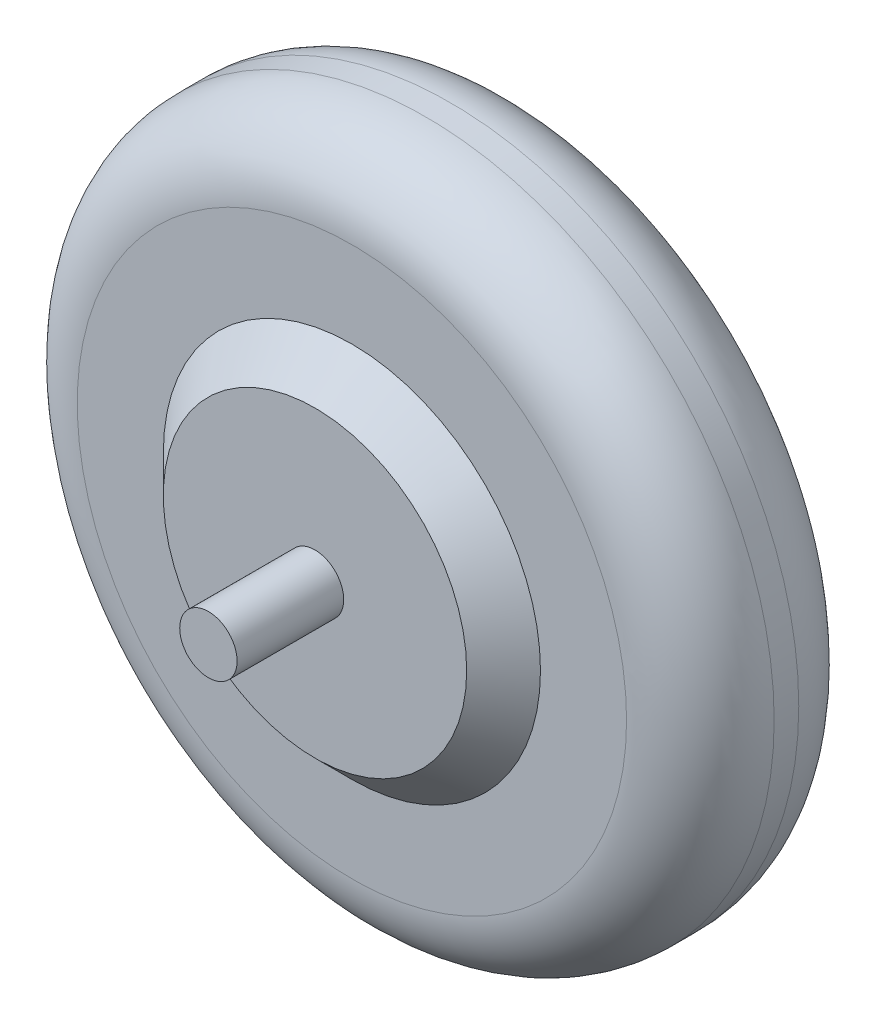
ISO-10303-21;
HEADER;
FILE_DESCRIPTION(('STEP AP214'),'2;1');
FILE_NAME('part.step','',(''),(''),'','','');
FILE_SCHEMA(('AUTOMOTIVE_DESIGN { 1 0 10303 214 1 1 1 1 }'));
ENDSEC;
DATA;
#1=APPLICATION_CONTEXT('core data for automotive mechanical design processes');
#2=APPLICATION_PROTOCOL_DEFINITION('international standard','automotive_design',2000,#1);
#3=PRODUCT_CONTEXT('',#1,'mechanical');
#4=PRODUCT('Part','Part','',(#3));
#5=PRODUCT_RELATED_PRODUCT_CATEGORY('part','',(#4));
#6=PRODUCT_DEFINITION_FORMATION('','',#4);
#7=PRODUCT_DEFINITION_CONTEXT('part definition',#1,'design');
#8=PRODUCT_DEFINITION('design','',#6,#7);
#9=PRODUCT_DEFINITION_SHAPE('','',#8);
#10=(LENGTH_UNIT() NAMED_UNIT(*) SI_UNIT(.MILLI.,.METRE.));
#11=(NAMED_UNIT(*) PLANE_ANGLE_UNIT() SI_UNIT($,.RADIAN.));
#12=(NAMED_UNIT(*) SI_UNIT($,.STERADIAN.) SOLID_ANGLE_UNIT());
#13=UNCERTAINTY_MEASURE_WITH_UNIT(LENGTH_MEASURE(1.E-05),#10,'distance_accuracy_value','');
#14=(GEOMETRIC_REPRESENTATION_CONTEXT(3) GLOBAL_UNCERTAINTY_ASSIGNED_CONTEXT((#13)) GLOBAL_UNIT_ASSIGNED_CONTEXT((#10,
#11,#12)) REPRESENTATION_CONTEXT('',''));
#15=CARTESIAN_POINT('',(0.,0.,0.));
#16=DIRECTION('',(0.,0.,1.));
#17=DIRECTION('',(1.,0.,0.));
#18=AXIS2_PLACEMENT_3D('',#15,#16,#17);
#19=CARTESIAN_POINT('',(0.,0.,-62.));
#20=DIRECTION('',(0.,0.,-1.));
#21=DIRECTION('',(-1.,0.,0.));
#22=AXIS2_PLACEMENT_3D('',#19,#20,#21);
#23=PLANE('',#22);
#24=CARTESIAN_POINT('',(0.,0.,-62.));
#25=DIRECTION('',(0.,0.,-1.));
#26=DIRECTION('',(-1.,0.,0.));
#27=AXIS2_PLACEMENT_3D('',#24,#25,#26);
#28=CIRCLE('',#27,6.00000000000001);
#29=CARTESIAN_POINT('',(-5.,3.31662479035541,-62.));
#30=VERTEX_POINT('',#29);
#31=CARTESIAN_POINT('',(0.,6.00000000000001,-62.));
#32=VERTEX_POINT('',#31);
#33=EDGE_CURVE('E273',#30,#32,#28,.T.);
#34=ORIENTED_EDGE('',*,*,#33,.T.);
#35=DIRECTION('',(0.,-1.,0.));
#36=VECTOR('',#35,1.);
#37=CARTESIAN_POINT('',(0.,0.,-62.));
#38=LINE('',#37,#36);
#39=CARTESIAN_POINT('',(0.,3.5,-62.));
#40=VERTEX_POINT('',#39);
#41=EDGE_CURVE('E119',#32,#40,#38,.T.);
#42=ORIENTED_EDGE('',*,*,#41,.T.);
#43=CARTESIAN_POINT('',(0.,0.,-62.));
#44=DIRECTION('',(0.,0.,-1.));
#45=DIRECTION('',(-1.,0.,0.));
#46=AXIS2_PLACEMENT_3D('',#43,#44,#45);
#47=CIRCLE('',#46,3.5);
#48=CARTESIAN_POINT('',(0.,-3.5,-62.));
#49=VERTEX_POINT('',#48);
#50=EDGE_CURVE('E283',#49,#40,#47,.T.);
#51=ORIENTED_EDGE('',*,*,#50,.F.);
#52=CARTESIAN_POINT('',(0.,-6.00000000000001,-62.));
#53=VERTEX_POINT('',#52);
#54=EDGE_CURVE('E124',#49,#53,#38,.T.);
#55=ORIENTED_EDGE('',*,*,#54,.T.);
#56=CARTESIAN_POINT('',(0.,0.,-62.));
#57=DIRECTION('',(0.,0.,-1.));
#58=DIRECTION('',(-1.,0.,0.));
#59=AXIS2_PLACEMENT_3D('',#56,#57,#58);
#60=CIRCLE('',#59,6.00000000000001);
#61=CARTESIAN_POINT('',(-5.,-3.31662479035541,-62.));
#62=VERTEX_POINT('',#61);
#63=EDGE_CURVE('E274',#53,#62,#60,.T.);
#64=ORIENTED_EDGE('',*,*,#63,.T.);
#65=DIRECTION('',(0.,1.,0.));
#66=VECTOR('',#65,1.);
#67=CARTESIAN_POINT('',(-5.,0.,-62.));
#68=LINE('',#67,#66);
#69=EDGE_CURVE('E267',#62,#30,#68,.T.);
#70=ORIENTED_EDGE('',*,*,#69,.T.);
#71=EDGE_LOOP('',(#34,#42,#51,#55,#64,#70));
#72=FACE_BOUND('',#71,.T.);
#73=ADVANCED_FACE('F39',(#72),#23,.T.);
#74=CARTESIAN_POINT('',(0.,0.,-17.));
#75=DIRECTION('',(0.,0.,-1.));
#76=DIRECTION('',(-1.,0.,0.));
#77=AXIS2_PLACEMENT_3D('',#74,#75,#76);
#78=CYLINDRICAL_SURFACE('',#77,3.5);
#79=CARTESIAN_POINT('',(0.,0.,-17.));
#80=DIRECTION('',(0.,0.,-1.));
#81=DIRECTION('',(-1.,0.,0.));
#82=AXIS2_PLACEMENT_3D('',#79,#80,#81);
#83=CIRCLE('',#82,3.5);
#84=CARTESIAN_POINT('',(-3.5,0.,-17.));
#85=VERTEX_POINT('',#84);
#86=EDGE_CURVE('E173',#85,#85,#83,.T.);
#87=ORIENTED_EDGE('',*,*,#86,.F.);
#88=EDGE_LOOP('',(#87));
#89=FACE_BOUND('',#88,.T.);
#90=DIRECTION('',(0.,0.,-1.));
#91=VECTOR('',#90,1.);
#92=CARTESIAN_POINT('',(0.,-3.5,-17.));
#93=LINE('',#92,#91);
#94=CARTESIAN_POINT('',(0.,-3.5,-55.9378221735089));
#95=VERTEX_POINT('',#94);
#96=EDGE_CURVE('E288',#49,#95,#93,.F.);
#97=ORIENTED_EDGE('',*,*,#96,.F.);
#98=ORIENTED_EDGE('',*,*,#50,.T.);
#99=DIRECTION('',(0.,0.,-1.));
#100=VECTOR('',#99,1.);
#101=CARTESIAN_POINT('',(0.,3.5,-17.));
#102=LINE('',#101,#100);
#103=CARTESIAN_POINT('',(0.,3.5,-55.9378221735089));
#104=VERTEX_POINT('',#103);
#105=EDGE_CURVE('E287',#104,#40,#102,.T.);
#106=ORIENTED_EDGE('',*,*,#105,.F.);
#107=CARTESIAN_POINT('',(0.,3.5,-55.9378221735089));
#108=CARTESIAN_POINT('',(0.0916614106132162,3.50001651318873,-55.9378491324622));
#109=CARTESIAN_POINT('',(0.18330783847139,3.49639979045156,-55.9357439525906));
#110=CARTESIAN_POINT('',(0.36580025899866,3.48202985654384,-55.9274723056872));
#111=CARTESIAN_POINT('',(0.456646708730063,3.4712810300505,-55.9213083339386));
#112=CARTESIAN_POINT('',(0.636366547399989,3.44285826737843,-55.9051680198482));
#113=CARTESIAN_POINT('',(0.725248260587919,3.42522437530652,-55.8952137304526));
#114=CARTESIAN_POINT('',(0.900938654282858,3.38326415889156,-55.8718600499086));
#115=CARTESIAN_POINT('',(0.987747095428591,3.35893706583233,-55.8584602630553));
#116=CARTESIAN_POINT('',(1.24384968450897,3.27641552648077,-55.8138029850928));
#117=CARTESIAN_POINT('',(1.40936471778677,3.20859298159029,-55.7780344118746));
#118=CARTESIAN_POINT('',(1.72678349029069,3.04956767111259,-55.698570475309));
#119=CARTESIAN_POINT('',(1.87866564252661,2.95832867849381,-55.6548628605585));
#120=CARTESIAN_POINT('',(2.17808050806032,2.74631964906835,-55.5601042618337));
#121=CARTESIAN_POINT('',(2.32424149658465,2.62374464456448,-55.5087450506434));
#122=CARTESIAN_POINT('',(2.59495627349913,2.35636512618243,-55.4069702272501));
#123=CARTESIAN_POINT('',(2.71950419979423,2.21155460139175,-55.3565548743466));
#124=CARTESIAN_POINT('',(2.95179799377422,1.89167369295779,-55.2582436589313));
#125=CARTESIAN_POINT('',(3.05784144738486,1.71522030585591,-55.2107477899197));
#126=CARTESIAN_POINT('',(3.19299061321122,1.43717815530636,-55.1484586891389));
#127=CARTESIAN_POINT('',(3.23406538888504,1.34223180904005,-55.1291824856837));
#128=CARTESIAN_POINT('',(3.30781168974839,1.14851994741149,-55.0941649556951));
#129=CARTESIAN_POINT('',(3.34048793504924,1.04975661332343,-55.0784216442527));
#130=CARTESIAN_POINT('',(3.39501688969959,0.856293812361105,-55.051934457675));
#131=CARTESIAN_POINT('',(3.41747166572956,0.761800976383333,-55.0409157371288));
#132=CARTESIAN_POINT('',(3.45448155122859,0.570962688949776,-55.0226664657273));
#133=CARTESIAN_POINT('',(3.46904052545878,0.474618167794387,-55.0154340616425));
#134=CARTESIAN_POINT('',(3.49007309097626,0.280853657180163,-55.0049642869495));
#135=CARTESIAN_POINT('',(3.49654886840493,0.183433965700494,-55.0017258361593));
#136=CARTESIAN_POINT('',(3.50134238028244,-0.0116257308125945,-54.9993284204132));
#137=CARTESIAN_POINT('',(3.49966061376685,-0.109265722003992,-55.0001692059111));
#138=CARTESIAN_POINT('',(3.48337483784478,-0.384296801255904,-55.0083078266267));
#139=CARTESIAN_POINT('',(3.45926330114768,-0.56109576080786,-55.0203561361947));
#140=CARTESIAN_POINT('',(3.38491926786074,-0.907633271701649,-55.056898622937));
#141=CARTESIAN_POINT('',(3.33468531485208,-1.07737142880839,-55.0813934940502));
#142=CARTESIAN_POINT('',(3.20921045116487,-1.40807298244682,-55.1409952713425));
#143=CARTESIAN_POINT('',(3.13363312281082,-1.56888245594173,-55.1762443324252));
#144=CARTESIAN_POINT('',(2.96008039903263,-1.8759187786992,-55.2541814480871));
#145=CARTESIAN_POINT('',(2.86209665424759,-2.02214016271809,-55.2968722742974));
#146=CARTESIAN_POINT('',(2.63587110135662,-2.31059815388992,-55.3904433918485));
#147=CARTESIAN_POINT('',(2.50564553098241,-2.45115403567686,-55.441716341548));
#148=CARTESIAN_POINT('',(2.22396641369221,-2.7093470037211,-55.5440902878225));
#149=CARTESIAN_POINT('',(2.07249396563669,-2.82696345798846,-55.5951910893479));
#150=CARTESIAN_POINT('',(1.74057142656073,-3.0433576919829,-55.6949942738554));
#151=CARTESIAN_POINT('',(1.55888564357469,-3.14044252971586,-55.7433323954387));
#152=CARTESIAN_POINT('',(1.27418493247696,-3.26145680927839,-55.80605473572));
#153=CARTESIAN_POINT('',(1.17731033622517,-3.29768010784926,-55.8253237851619));
#154=CARTESIAN_POINT('',(0.980110609154598,-3.3615642090718,-55.8598694712466));
#155=CARTESIAN_POINT('',(0.879786994444197,-3.389228721819,-55.8751478373378));
#156=CARTESIAN_POINT('',(0.651355096066804,-3.44130970453806,-55.904222174323));
#157=CARTESIAN_POINT('',(0.522494881956278,-3.46324371558164,-55.9167239286881));
#158=CARTESIAN_POINT('',(0.327551673421803,-3.48525610307998,-55.9293285418068));
#159=CARTESIAN_POINT('',(0.262226521326312,-3.49077885186311,-55.9325055032429));
#160=CARTESIAN_POINT('',(0.131274595581618,-3.4981521730547,-55.9367549015169));
#161=CARTESIAN_POINT('',(0.0656477095949152,-3.50000124407169,-55.9378264779052));
#162=CARTESIAN_POINT('',(0.,-3.5,-55.9378221735089));
#163=B_SPLINE_CURVE_WITH_KNOTS('',3,(#107,#108,#109,#110,#111,#112,#113,#114,#115,#116,#117,
#118,#119,#120,#121,#122,#123,#124,#125,#126,#127,#128,#129,#130,#131,#132,#133,#134,#135,#136,
#137,#138,#139,#140,#141,#142,#143,#144,#145,#146,#147,#148,#149,#150,#151,#152,#153,#154,#155,
#156,#157,#158,#159,#160,#161,#162),.UNSPECIFIED.,.F.,.F.,(4,2,2,2,2,2,2,2,2,2,2,2,2,2,2,2,2,2,
2,2,2,2,2,2,2,2,2,4),(0.,0.274864177751955,0.54955953078364,0.822680477503826,1.09583280535154,
1.64049867517977,2.18601231816781,2.7761426380743,3.36643276926798,3.99658159461522,
4.31189570928676,4.62703222285006,4.91987971471091,5.21258373673095,5.50520857830588,
5.79781551885987,6.33157319195034,6.86536062714517,7.40653440283131,7.94791016706229,
8.54041803466568,9.13345637783704,9.76454552647258,10.0797576744246,10.3948329909235,
10.787590386813,10.9843776384837,11.1812452983972),.UNSPECIFIED.);
#164=EDGE_CURVE('E131',#104,#95,#163,.T.);
#165=ORIENTED_EDGE('',*,*,#164,.T.);
#166=EDGE_LOOP('',(#97,#98,#106,#165));
#167=FACE_BOUND('',#166,.T.);
#168=ADVANCED_FACE('F204',(#89,#167),#78,.F.);
#169=CARTESIAN_POINT('',(0.,0.,-62.));
#170=DIRECTION('',(0.,0.,1.));
#171=DIRECTION('',(1.,0.,0.));
#172=AXIS2_PLACEMENT_3D('',#169,#170,#171);
#173=CYLINDRICAL_SURFACE('',#172,7.);
#174=CARTESIAN_POINT('',(0.,0.,-30.));
#175=DIRECTION('',(0.,0.,1.));
#176=DIRECTION('',(1.,0.,0.));
#177=AXIS2_PLACEMENT_3D('',#174,#175,#176);
#178=CIRCLE('',#177,7.);
#179=CARTESIAN_POINT('',(7.,0.,-30.));
#180=VERTEX_POINT('',#179);
#181=EDGE_CURVE('E259',#180,#180,#178,.F.);
#182=ORIENTED_EDGE('',*,*,#181,.T.);
#183=EDGE_LOOP('',(#182));
#184=FACE_BOUND('',#183,.T.);
#185=CARTESIAN_POINT('',(0.,0.,-61.));
#186=DIRECTION('',(0.,0.,-1.));
#187=DIRECTION('',(-1.,0.,0.));
#188=AXIS2_PLACEMENT_3D('',#185,#186,#187);
#189=CIRCLE('',#188,7.);
#190=CARTESIAN_POINT('',(-5.,-4.89897948556636,-61.));
#191=VERTEX_POINT('',#190);
#192=CARTESIAN_POINT('',(0.999999999999995,-6.92820323027551,-61.));
#193=VERTEX_POINT('',#192);
#194=EDGE_CURVE('E314',#191,#193,#189,.F.);
#195=ORIENTED_EDGE('',*,*,#194,.T.);
#196=CARTESIAN_POINT('',(0.,0.,-62.));
#197=DIRECTION('',(-0.707106781186547,0.,0.707106781186547));
#198=DIRECTION('',(0.707106781186547,0.,0.707106781186547));
#199=AXIS2_PLACEMENT_3D('',#196,#197,#198);
#200=ELLIPSE('',#199,9.89949493661167,7.);
#201=CARTESIAN_POINT('',(5.,-4.89897948556635,-57.));
#202=VERTEX_POINT('',#201);
#203=EDGE_CURVE('E142',#193,#202,#200,.T.);
#204=ORIENTED_EDGE('',*,*,#203,.T.);
#205=DIRECTION('',(0.,0.,1.));
#206=VECTOR('',#205,1.);
#207=CARTESIAN_POINT('',(5.,-4.89897948556636,-62.));
#208=LINE('',#207,#206);
#209=CARTESIAN_POINT('',(5.,-4.89897948556636,-34.));
#210=VERTEX_POINT('',#209);
#211=EDGE_CURVE('E300',#210,#202,#208,.F.);
#212=ORIENTED_EDGE('',*,*,#211,.F.);
#213=CARTESIAN_POINT('',(0.,0.,-34.));
#214=DIRECTION('',(0.,0.,-1.));
#215=DIRECTION('',(-1.,0.,0.));
#216=AXIS2_PLACEMENT_3D('',#213,#214,#215);
#217=CIRCLE('',#216,7.);
#218=CARTESIAN_POINT('',(5.,4.89897948556636,-34.));
#219=VERTEX_POINT('',#218);
#220=EDGE_CURVE('E272',#219,#210,#217,.T.);
#221=ORIENTED_EDGE('',*,*,#220,.F.);
#222=DIRECTION('',(0.,0.,1.));
#223=VECTOR('',#222,1.);
#224=CARTESIAN_POINT('',(5.,4.89897948556636,-62.));
#225=LINE('',#224,#223);
#226=CARTESIAN_POINT('',(5.,4.89897948556635,-57.));
#227=VERTEX_POINT('',#226);
#228=EDGE_CURVE('E303',#227,#219,#225,.T.);
#229=ORIENTED_EDGE('',*,*,#228,.F.);
#230=CARTESIAN_POINT('',(0.999999999999995,6.92820323027551,-61.));
#231=VERTEX_POINT('',#230);
#232=EDGE_CURVE('E137',#227,#231,#200,.T.);
#233=ORIENTED_EDGE('',*,*,#232,.T.);
#234=CARTESIAN_POINT('',(0.,0.,-61.));
#235=DIRECTION('',(0.,0.,-1.));
#236=DIRECTION('',(-1.,0.,0.));
#237=AXIS2_PLACEMENT_3D('',#234,#235,#236);
#238=CIRCLE('',#237,7.);
#239=CARTESIAN_POINT('',(-5.,4.89897948556636,-61.));
#240=VERTEX_POINT('',#239);
#241=EDGE_CURVE('E62',#231,#240,#238,.F.);
#242=ORIENTED_EDGE('',*,*,#241,.T.);
#243=DIRECTION('',(0.,0.,1.));
#244=VECTOR('',#243,1.);
#245=CARTESIAN_POINT('',(-5.,4.89897948556636,-62.));
#246=LINE('',#245,#244);
#247=CARTESIAN_POINT('',(-5.,4.89897948556636,-34.));
#248=VERTEX_POINT('',#247);
#249=EDGE_CURVE('E280',#248,#240,#246,.F.);
#250=ORIENTED_EDGE('',*,*,#249,.F.);
#251=CARTESIAN_POINT('',(-5.,-4.89897948556636,-34.));
#252=VERTEX_POINT('',#251);
#253=EDGE_CURVE('E270',#252,#248,#217,.T.);
#254=ORIENTED_EDGE('',*,*,#253,.F.);
#255=DIRECTION('',(0.,0.,1.));
#256=VECTOR('',#255,1.);
#257=CARTESIAN_POINT('',(-5.,-4.89897948556636,-62.));
#258=LINE('',#257,#256);
#259=EDGE_CURVE('E298',#191,#252,#258,.T.);
#260=ORIENTED_EDGE('',*,*,#259,.F.);
#261=EDGE_LOOP('',(#195,#204,#212,#221,#229,#233,#242,#250,#254,#260));
#262=FACE_BOUND('',#261,.T.);
#263=ADVANCED_FACE('F217',(#184,#262),#173,.T.);
#264=CARTESIAN_POINT('',(0.,0.,21.));
#265=DIRECTION('',(0.,0.,-1.));
#266=DIRECTION('',(-1.,0.,0.));
#267=AXIS2_PLACEMENT_3D('',#264,#265,#266);
#268=CYLINDRICAL_SURFACE('',#267,85.);
#269=CARTESIAN_POINT('',(0.,0.,-3.00000000000001));
#270=DIRECTION('',(0.,0.,1.));
#271=DIRECTION('',(1.,0.,0.));
#272=AXIS2_PLACEMENT_3D('',#269,#270,#271);
#273=CIRCLE('',#272,85.);
#274=CARTESIAN_POINT('',(-85.,0.,-3.00000000000001));
#275=VERTEX_POINT('',#274);
#276=EDGE_CURVE('E355',#275,#275,#273,.T.);
#277=CARTESIAN_POINT('',(0.,0.,3.));
#278=DIRECTION('',(0.,0.,1.));
#279=DIRECTION('',(1.,0.,0.));
#280=AXIS2_PLACEMENT_3D('',#277,#278,#279);
#281=CIRCLE('',#280,85.);
#282=CARTESIAN_POINT('',(-85.,0.,3.));
#283=VERTEX_POINT('',#282);
#284=EDGE_CURVE('E350',#283,#283,#281,.F.);
#285=CARTESIAN_POINT('',(-85.,0.,-3.00000000000001));
#286=CARTESIAN_POINT('',(-85.,0.,-2.93750000000001));
#287=CARTESIAN_POINT('',(-85.,0.,-2.87500000000001));
#288=CARTESIAN_POINT('',(-85.,0.,-2.75000000000001));
#289=CARTESIAN_POINT('',(-85.,0.,-2.68750000000001));
#290=CARTESIAN_POINT('',(-85.,0.,-2.56250000000001));
#291=CARTESIAN_POINT('',(-85.,0.,-2.50000000000001));
#292=CARTESIAN_POINT('',(-85.,0.,-2.37500000000001));
#293=CARTESIAN_POINT('',(-85.,0.,-2.31250000000001));
#294=CARTESIAN_POINT('',(-85.,0.,-2.18750000000001));
#295=CARTESIAN_POINT('',(-85.,0.,-2.12500000000001));
#296=CARTESIAN_POINT('',(-85.,0.,-2.00000000000001));
#297=CARTESIAN_POINT('',(-85.,0.,-1.93750000000001));
#298=CARTESIAN_POINT('',(-85.,0.,-1.81250000000001));
#299=CARTESIAN_POINT('',(-85.,0.,-1.75000000000001));
#300=CARTESIAN_POINT('',(-85.,0.,-1.62500000000001));
#301=CARTESIAN_POINT('',(-85.,0.,-1.56250000000001));
#302=CARTESIAN_POINT('',(-85.,0.,-1.43750000000001));
#303=CARTESIAN_POINT('',(-85.,0.,-1.37500000000001));
#304=CARTESIAN_POINT('',(-85.,0.,-1.25000000000001));
#305=CARTESIAN_POINT('',(-85.,0.,-1.18750000000001));
#306=CARTESIAN_POINT('',(-85.,0.,-1.06250000000001));
#307=CARTESIAN_POINT('',(-85.,0.,-1.00000000000001));
#308=CARTESIAN_POINT('',(-85.,0.,-0.875000000000008));
#309=CARTESIAN_POINT('',(-85.,0.,-0.812500000000008));
#310=CARTESIAN_POINT('',(-85.,0.,-0.687500000000008));
#311=CARTESIAN_POINT('',(-85.,0.,-0.625000000000008));
#312=CARTESIAN_POINT('',(-85.,0.,-0.500000000000007));
#313=CARTESIAN_POINT('',(-85.,0.,-0.437500000000007));
#314=CARTESIAN_POINT('',(-85.,0.,-0.312500000000007));
#315=CARTESIAN_POINT('',(-85.,0.,-0.250000000000007));
#316=CARTESIAN_POINT('',(-85.,0.,-0.125000000000007));
#317=CARTESIAN_POINT('',(-85.,0.,-0.062500000000007));
#318=CARTESIAN_POINT('',(-85.,0.,0.0624999999999931));
#319=CARTESIAN_POINT('',(-85.,0.,0.124999999999993));
#320=CARTESIAN_POINT('',(-85.,0.,0.249999999999993));
#321=CARTESIAN_POINT('',(-85.,0.,0.312499999999993));
#322=CARTESIAN_POINT('',(-85.,0.,0.437499999999993));
#323=CARTESIAN_POINT('',(-85.,0.,0.499999999999994));
#324=CARTESIAN_POINT('',(-85.,0.,0.624999999999994));
#325=CARTESIAN_POINT('',(-85.,0.,0.687499999999994));
#326=CARTESIAN_POINT('',(-85.,0.,0.812499999999994));
#327=CARTESIAN_POINT('',(-85.,0.,0.874999999999994));
#328=CARTESIAN_POINT('',(-85.,0.,0.999999999999994));
#329=CARTESIAN_POINT('',(-85.,0.,1.06249999999999));
#330=CARTESIAN_POINT('',(-85.,0.,1.18749999999999));
#331=CARTESIAN_POINT('',(-85.,0.,1.24999999999999));
#332=CARTESIAN_POINT('',(-85.,0.,1.37499999999999));
#333=CARTESIAN_POINT('',(-85.,0.,1.43749999999999));
#334=CARTESIAN_POINT('',(-85.,0.,1.56249999999999));
#335=CARTESIAN_POINT('',(-85.,0.,1.62499999999999));
#336=CARTESIAN_POINT('',(-85.,0.,1.74999999999999));
#337=CARTESIAN_POINT('',(-85.,0.,1.81249999999999));
#338=CARTESIAN_POINT('',(-85.,0.,1.93749999999999));
#339=CARTESIAN_POINT('',(-85.,0.,1.99999999999999));
#340=CARTESIAN_POINT('',(-85.,0.,2.125));
#341=CARTESIAN_POINT('',(-85.,0.,2.1875));
#342=CARTESIAN_POINT('',(-85.,0.,2.3125));
#343=CARTESIAN_POINT('',(-85.,0.,2.375));
#344=CARTESIAN_POINT('',(-85.,0.,2.5));
#345=CARTESIAN_POINT('',(-85.,0.,2.5625));
#346=CARTESIAN_POINT('',(-85.,0.,2.6875));
#347=CARTESIAN_POINT('',(-85.,0.,2.75));
#348=CARTESIAN_POINT('',(-85.,0.,2.875));
#349=CARTESIAN_POINT('',(-85.,0.,2.9375));
#350=CARTESIAN_POINT('',(-85.,0.,3.));
#351=B_SPLINE_CURVE_WITH_KNOTS('',3,(#285,#286,#287,#288,#289,#290,#291,#292,#293,#294,#295,
#296,#297,#298,#299,#300,#301,#302,#303,#304,#305,#306,#307,#308,#309,#310,#311,#312,#313,#314,
#315,#316,#317,#318,#319,#320,#321,#322,#323,#324,#325,#326,#327,#328,#329,#330,#331,#332,#333,
#334,#335,#336,#337,#338,#339,#340,#341,#342,#343,#344,#345,#346,#347,#348,#349,#350),
.UNSPECIFIED.,.F.,.F.,(4,2,2,2,2,2,2,2,2,2,2,2,2,2,2,2,2,2,2,2,2,2,2,2,2,2,2,2,2,2,2,2,4),(0.,
0.1875,0.375,0.5625,0.750000000000001,0.937500000000001,1.125,1.3125,1.5,1.6875,1.875,2.0625,
2.25,2.4375,2.625,2.8125,3.,3.1875,3.375,3.5625,3.75,3.9375,4.125,4.3125,4.5,4.6875,4.875,
5.0625,5.25,5.4375,5.62500000000001,5.81250000000001,6.00000000000001),.UNSPECIFIED.);
#352=EDGE_CURVE('BSEAM220',#275,#283,#351,.T.);
#353=ORIENTED_EDGE('',*,*,#276,.T.);
#354=ORIENTED_EDGE('',*,*,#284,.T.);
#355=ORIENTED_EDGE('',*,*,#352,.T.);
#356=ORIENTED_EDGE('',*,*,#352,.F.);
#357=EDGE_LOOP('',(#353,#355,#354,#356));
#358=FACE_BOUND('',#357,.T.);
#359=ADVANCED_FACE('F220',(#358),#268,.T.);
#360=CARTESIAN_POINT('',(0.,0.,21.));
#361=DIRECTION('',(0.,0.,1.));
#362=DIRECTION('',(1.,0.,0.));
#363=AXIS2_PLACEMENT_3D('',#360,#361,#362);
#364=PLANE('',#363);
#365=CARTESIAN_POINT('',(0.,0.,21.));
#366=DIRECTION('',(0.,0.,1.));
#367=DIRECTION('',(1.,0.,0.));
#368=AXIS2_PLACEMENT_3D('',#365,#366,#367);
#369=CIRCLE('',#368,67.);
#370=CARTESIAN_POINT('',(67.,0.,21.));
#371=VERTEX_POINT('',#370);
#372=EDGE_CURVE('E12',#371,#371,#369,.T.);
#373=ORIENTED_EDGE('',*,*,#372,.T.);
#374=EDGE_LOOP('',(#373));
#375=FACE_BOUND('',#374,.T.);
#376=CARTESIAN_POINT('',(0.,0.,21.));
#377=DIRECTION('',(0.,0.,1.));
#378=DIRECTION('',(1.,0.,0.));
#379=AXIS2_PLACEMENT_3D('',#376,#377,#378);
#380=CIRCLE('',#379,45.9999999999999);
#381=CARTESIAN_POINT('',(45.9999999999999,0.,21.));
#382=VERTEX_POINT('',#381);
#383=EDGE_CURVE('E255',#382,#382,#380,.F.);
#384=ORIENTED_EDGE('',*,*,#383,.T.);
#385=EDGE_LOOP('',(#384));
#386=FACE_BOUND('',#385,.T.);
#387=ADVANCED_FACE('F232',(#375,#386),#364,.T.);
#388=CARTESIAN_POINT('',(0.,0.,-21.));
#389=DIRECTION('',(0.,0.,1.));
#390=DIRECTION('',(1.,0.,0.));
#391=AXIS2_PLACEMENT_3D('',#388,#389,#390);
#392=PLANE('',#391);
#393=CARTESIAN_POINT('',(0.,0.,-21.));
#394=DIRECTION('',(0.,0.,1.));
#395=DIRECTION('',(1.,0.,0.));
#396=AXIS2_PLACEMENT_3D('',#393,#394,#395);
#397=CIRCLE('',#396,67.);
#398=CARTESIAN_POINT('',(67.,0.,-21.));
#399=VERTEX_POINT('',#398);
#400=EDGE_CURVE('E47',#399,#399,#397,.F.);
#401=ORIENTED_EDGE('',*,*,#400,.T.);
#402=EDGE_LOOP('',(#401));
#403=FACE_BOUND('',#402,.T.);
#404=CARTESIAN_POINT('',(0.,0.,-21.));
#405=DIRECTION('',(0.,0.,1.));
#406=DIRECTION('',(1.,0.,0.));
#407=AXIS2_PLACEMENT_3D('',#404,#405,#406);
#408=CIRCLE('',#407,45.9999999999998);
#409=CARTESIAN_POINT('',(45.9999999999998,0.,-21.));
#410=VERTEX_POINT('',#409);
#411=EDGE_CURVE('E253',#410,#410,#408,.T.);
#412=ORIENTED_EDGE('',*,*,#411,.T.);
#413=EDGE_LOOP('',(#412));
#414=FACE_BOUND('',#413,.T.);
#415=ADVANCED_FACE('F230',(#403,#414),#392,.F.);
#416=CARTESIAN_POINT('',(0.,0.,-30.));
#417=DIRECTION('',(0.,0.,1.));
#418=DIRECTION('',(1.,0.,0.));
#419=AXIS2_PLACEMENT_3D('',#416,#417,#418);
#420=PLANE('',#419);
#421=ORIENTED_EDGE('',*,*,#181,.F.);
#422=EDGE_LOOP('',(#421));
#423=FACE_BOUND('',#422,.T.);
#424=CARTESIAN_POINT('',(0.,0.,-30.));
#425=DIRECTION('',(0.,0.,1.));
#426=DIRECTION('',(1.,0.,0.));
#427=AXIS2_PLACEMENT_3D('',#424,#425,#426);
#428=CIRCLE('',#427,36.9999999999999);
#429=CARTESIAN_POINT('',(36.9999999999999,0.,-30.));
#430=VERTEX_POINT('',#429);
#431=EDGE_CURVE('E250',#430,#430,#428,.F.);
#432=ORIENTED_EDGE('',*,*,#431,.T.);
#433=EDGE_LOOP('',(#432));
#434=FACE_BOUND('',#433,.T.);
#435=ADVANCED_FACE('F226',(#423,#434),#420,.F.);
#436=CARTESIAN_POINT('',(0.,0.,30.));
#437=DIRECTION('',(0.,0.,1.));
#438=DIRECTION('',(1.,0.,0.));
#439=AXIS2_PLACEMENT_3D('',#436,#437,#438);
#440=PLANE('',#439);
#441=CARTESIAN_POINT('',(0.,0.,30.));
#442=DIRECTION('',(0.,0.,1.));
#443=DIRECTION('',(1.,0.,0.));
#444=AXIS2_PLACEMENT_3D('',#441,#442,#443);
#445=CIRCLE('',#444,7.);
#446=CARTESIAN_POINT('',(-7.,0.,30.));
#447=VERTEX_POINT('',#446);
#448=EDGE_CURVE('E321',#447,#447,#445,.T.);
#449=ORIENTED_EDGE('',*,*,#448,.F.);
#450=EDGE_LOOP('',(#449));
#451=FACE_BOUND('',#450,.T.);
#452=CARTESIAN_POINT('',(0.,0.,30.));
#453=DIRECTION('',(0.,0.,1.));
#454=DIRECTION('',(1.,0.,0.));
#455=AXIS2_PLACEMENT_3D('',#452,#453,#454);
#456=CIRCLE('',#455,36.9999999999998);
#457=CARTESIAN_POINT('',(36.9999999999998,0.,30.));
#458=VERTEX_POINT('',#457);
#459=EDGE_CURVE('E256',#458,#458,#456,.T.);
#460=ORIENTED_EDGE('',*,*,#459,.T.);
#461=EDGE_LOOP('',(#460));
#462=FACE_BOUND('',#461,.T.);
#463=ADVANCED_FACE('F222',(#451,#462),#440,.T.);
#464=CARTESIAN_POINT('',(0.,0.,-19.9999999999998));
#465=DIRECTION('',(0.,0.,1.));
#466=DIRECTION('',(1.,0.,0.));
#467=AXIS2_PLACEMENT_3D('',#464,#465,#466);
#468=CONICAL_SURFACE('',#467,47.,0.785398163397443);
#469=ORIENTED_EDGE('',*,*,#431,.F.);
#470=EDGE_LOOP('',(#469));
#471=FACE_BOUND('',#470,.T.);
#472=ORIENTED_EDGE('',*,*,#411,.F.);
#473=EDGE_LOOP('',(#472));
#474=FACE_BOUND('',#473,.T.);
#475=ADVANCED_FACE('F225',(#471,#474),#468,.T.);
#476=CARTESIAN_POINT('',(0.,0.,30.));
#477=DIRECTION('',(0.,0.,-1.));
#478=DIRECTION('',(-1.,0.,0.));
#479=AXIS2_PLACEMENT_3D('',#476,#477,#478);
#480=CONICAL_SURFACE('',#479,36.9999999999998,0.785398163397453);
#481=ORIENTED_EDGE('',*,*,#383,.F.);
#482=EDGE_LOOP('',(#481));
#483=FACE_BOUND('',#482,.T.);
#484=ORIENTED_EDGE('',*,*,#459,.F.);
#485=EDGE_LOOP('',(#484));
#486=FACE_BOUND('',#485,.T.);
#487=ADVANCED_FACE('F181',(#483,#486),#480,.T.);
#488=CARTESIAN_POINT('',(-5.,-7.,-34.));
#489=DIRECTION('',(-1.,0.,0.));
#490=DIRECTION('',(0.,0.,1.));
#491=AXIS2_PLACEMENT_3D('',#488,#489,#490);
#492=PLANE('',#491);
#493=ORIENTED_EDGE('',*,*,#69,.F.);
#494=CARTESIAN_POINT('',(-5.,-3.31662479035541,-62.));
#495=CARTESIAN_POINT('',(-5.,-3.45326610906923,-61.9244380953105));
#496=CARTESIAN_POINT('',(-5.,-3.58853736984222,-61.8464534870356));
#497=CARTESIAN_POINT('',(-5.,-3.85653589839369,-61.6864251092363));
#498=CARTESIAN_POINT('',(-5.,-3.98926484820427,-61.6043841618986));
#499=CARTESIAN_POINT('',(-5.,-4.25254031228116,-61.436937190208));
#500=CARTESIAN_POINT('',(-5.,-4.38308717626022,-61.3515317125823));
#501=CARTESIAN_POINT('',(-5.,-4.64236018599038,-61.1778075694677));
#502=CARTESIAN_POINT('',(-5.,-4.77108502253488,-61.0894869474584));
#503=CARTESIAN_POINT('',(-5.,-4.89897948556636,-61.));
#504=B_SPLINE_CURVE_WITH_KNOTS('',3,(#494,#495,#496,#497,#498,#499,#500,#501,#502,#503),
.UNSPECIFIED.,.F.,.F.,(4,2,2,2,4),(0.,0.468364382932266,0.936407366408807,1.40437460534381,
1.87266257941227),.UNSPECIFIED.);
#505=EDGE_CURVE('E185',#62,#191,#504,.T.);
#506=ORIENTED_EDGE('',*,*,#505,.T.);
#507=ORIENTED_EDGE('',*,*,#259,.T.);
#508=DIRECTION('',(0.,1.,0.));
#509=VECTOR('',#508,1.);
#510=CARTESIAN_POINT('',(-5.,-7.,-34.));
#511=LINE('',#510,#509);
#512=EDGE_CURVE('E295',#252,#248,#511,.T.);
#513=ORIENTED_EDGE('',*,*,#512,.T.);
#514=ORIENTED_EDGE('',*,*,#249,.T.);
#515=CARTESIAN_POINT('',(-5.,4.89897948556636,-61.));
#516=CARTESIAN_POINT('',(-5.,4.77108502253489,-61.0894869474584));
#517=CARTESIAN_POINT('',(-5.,4.64236018599039,-61.1778075694677));
#518=CARTESIAN_POINT('',(-5.,4.38308717626022,-61.3515317125823));
#519=CARTESIAN_POINT('',(-5.,4.25254031228116,-61.436937190208));
#520=CARTESIAN_POINT('',(-5.,3.98926484820427,-61.6043841618986));
#521=CARTESIAN_POINT('',(-5.,3.85653589839369,-61.6864251092363));
#522=CARTESIAN_POINT('',(-5.,3.58853736984222,-61.8464534870356));
#523=CARTESIAN_POINT('',(-5.,3.45326610906923,-61.9244380953105));
#524=CARTESIAN_POINT('',(-5.,3.31662479035541,-62.));
#525=B_SPLINE_CURVE_WITH_KNOTS('',3,(#515,#516,#517,#518,#519,#520,#521,#522,#523,#524),
.UNSPECIFIED.,.F.,.F.,(4,2,2,2,4),(0.,0.468287974068472,0.936255213003466,1.40429819648001,
1.87266257941227),.UNSPECIFIED.);
#526=EDGE_CURVE('E192',#240,#30,#525,.T.);
#527=ORIENTED_EDGE('',*,*,#526,.T.);
#528=EDGE_LOOP('',(#493,#506,#507,#513,#514,#527));
#529=FACE_BOUND('',#528,.T.);
#530=ADVANCED_FACE('F198',(#529),#492,.T.);
#531=CARTESIAN_POINT('',(0.,0.,-34.));
#532=DIRECTION('',(0.,0.,-1.));
#533=DIRECTION('',(-1.,0.,0.));
#534=AXIS2_PLACEMENT_3D('',#531,#532,#533);
#535=PLANE('',#534);
#536=ORIENTED_EDGE('',*,*,#253,.T.);
#537=ORIENTED_EDGE('',*,*,#512,.F.);
#538=EDGE_LOOP('',(#536,#537));
#539=FACE_BOUND('',#538,.T.);
#540=ADVANCED_FACE('F202',(#539),#535,.T.);
#541=ORIENTED_EDGE('',*,*,#220,.T.);
#542=DIRECTION('',(0.,-1.,0.));
#543=VECTOR('',#542,1.);
#544=CARTESIAN_POINT('',(5.,-7.,-34.));
#545=LINE('',#544,#543);
#546=EDGE_CURVE('E290',#219,#210,#545,.T.);
#547=ORIENTED_EDGE('',*,*,#546,.F.);
#548=EDGE_LOOP('',(#541,#547));
#549=FACE_BOUND('',#548,.T.);
#550=ADVANCED_FACE('F209',(#549),#535,.T.);
#551=CARTESIAN_POINT('',(5.,-7.,-34.));
#552=DIRECTION('',(1.,0.,0.));
#553=DIRECTION('',(0.,0.,-1.));
#554=AXIS2_PLACEMENT_3D('',#551,#552,#553);
#555=PLANE('',#554);
#556=CARTESIAN_POINT('',(5.,0.,-62.));
#557=DIRECTION('',(1.,0.,0.));
#558=DIRECTION('',(0.,0.,-1.));
#559=AXIS2_PLACEMENT_3D('',#556,#557,#558);
#560=CIRCLE('',#559,7.);
#561=EDGE_CURVE('E309',#227,#202,#560,.T.);
#562=ORIENTED_EDGE('',*,*,#561,.F.);
#563=ORIENTED_EDGE('',*,*,#228,.T.);
#564=ORIENTED_EDGE('',*,*,#546,.T.);
#565=ORIENTED_EDGE('',*,*,#211,.T.);
#566=EDGE_LOOP('',(#562,#563,#564,#565));
#567=FACE_BOUND('',#566,.T.);
#568=ADVANCED_FACE('F179',(#567),#555,.T.);
#569=CARTESIAN_POINT('',(0.,0.,-62.));
#570=DIRECTION('',(0.,0.,1.));
#571=DIRECTION('',(1.,0.,0.));
#572=AXIS2_PLACEMENT_3D('',#569,#570,#571);
#573=CONICAL_SURFACE('',#572,6.00000000000001,0.785398163397449);
#574=CARTESIAN_POINT('',(7.88197644233859,-5.86339299001392,-58.1763077209776));
#575=CARTESIAN_POINT('',(7.68880553891542,-5.93612986062236,-58.2878485479259));
#576=CARTESIAN_POINT('',(7.49376088083015,-6.00418095637374,-58.399152717344));
#577=CARTESIAN_POINT('',(7.10011309854123,-6.13147420646088,-58.6204551899651));
#578=CARTESIAN_POINT('',(6.90151033330966,-6.19071724388297,-58.7304536230609));
#579=CARTESIAN_POINT('',(6.5002773728699,-6.30114175810164,-58.9486715342435));
#580=CARTESIAN_POINT('',(6.2976366259612,-6.35229774932209,-59.0568844622544));
#581=CARTESIAN_POINT('',(5.88894581887537,-6.44685464861996,-59.2702240428911));
#582=CARTESIAN_POINT('',(5.68289570326783,-6.49025543047553,-59.3753506452614));
#583=CARTESIAN_POINT('',(5.26545523609346,-6.57017505716018,-59.582312953625));
#584=CARTESIAN_POINT('',(5.05403357451999,-6.60662873915729,-59.6841107223805));
#585=CARTESIAN_POINT('',(4.62745873477208,-6.67270841831737,-59.8820191103393));
#586=CARTESIAN_POINT('',(4.41230521152532,-6.70233378043123,-59.9781291999584));
#587=CARTESIAN_POINT('',(3.9784208588451,-6.75527499825252,-60.1627561358326));
#588=CARTESIAN_POINT('',(3.7596966327613,-6.77860135042145,-60.2512854441833));
#589=CARTESIAN_POINT('',(3.31812819877309,-6.81961514436075,-60.4187733892355));
#590=CARTESIAN_POINT('',(3.09528539921069,-6.83730447729523,-60.4977352302059));
#591=CARTESIAN_POINT('',(2.76775801833463,-6.85944136685614,-60.6038546151432));
#592=CARTESIAN_POINT('',(2.66475176239472,-6.86585709542066,-60.6358235236718));
#593=CARTESIAN_POINT('',(2.45785682924654,-6.87772255259245,-60.6969647330616));
#594=CARTESIAN_POINT('',(2.35396818212812,-6.88317231400203,-60.7261371288713));
#595=CARTESIAN_POINT('',(2.1454823448544,-6.89316436106357,-60.7813645633538));
#596=CARTESIAN_POINT('',(2.04088641376649,-6.89770796278395,-60.8074241006064));
#597=CARTESIAN_POINT('',(1.83087175088389,-6.90596262637078,-60.8561944515458));
#598=CARTESIAN_POINT('',(1.72545291873742,-6.90967358500279,-60.8789048498733));
#599=CARTESIAN_POINT('',(1.44568492486895,-6.9184680439033,-60.9341588294459));
#600=CARTESIAN_POINT('',(1.2706886713461,-6.92289521793987,-60.963609464637));
#601=CARTESIAN_POINT('',(0.919143080439585,-6.92990658282724,-61.0115739293386));
#602=CARTESIAN_POINT('',(0.742593619193842,-6.93249062532204,-61.0300868784403));
#603=CARTESIAN_POINT('',(0.388304100924697,-6.93598630549951,-61.0554033569354));
#604=CARTESIAN_POINT('',(0.210562467492055,-6.9368949081988,-61.0621856353745));
#605=CARTESIAN_POINT('',(-0.144976566839155,-6.93709451789683,-61.0636699188302));
#606=CARTESIAN_POINT('',(-0.322773970807911,-6.93638540968658,-61.0583710634611));
#607=CARTESIAN_POINT('',(-0.738950306189327,-6.93276932721855,-61.0320277520069));
#608=CARTESIAN_POINT('',(-0.977028153686124,-6.92918740966359,-61.0061741104105));
#609=CARTESIAN_POINT('',(-1.45033042091819,-6.91858816811849,-60.9349156233706));
#610=CARTESIAN_POINT('',(-1.68555171313848,-6.91156737525653,-60.8894910418563));
#611=CARTESIAN_POINT('',(-2.15237926935451,-6.89342532905023,-60.7819522493116));
#612=CARTESIAN_POINT('',(-2.38397773872287,-6.8822962407379,-60.7198062104382));
#613=CARTESIAN_POINT('',(-2.84230392548391,-6.85525214857155,-60.5820899921338));
#614=CARTESIAN_POINT('',(-3.06904168262191,-6.8393482903054,-60.5065512412094));
#615=CARTESIAN_POINT('',(-3.29348989985045,-6.82069017340237,-60.425774616374));
#616=B_SPLINE_CURVE_WITH_KNOTS('',3,(#574,#575,#576,#577,#578,#579,#580,#581,#582,#583,#584,
#585,#586,#587,#588,#589,#590,#591,#592,#593,#594,#595,#596,#597,#598,#599,#600,#601,#602,#603,
#604,#605,#606,#607,#608,#609,#610,#611,#612,#613,#614,#615),.UNSPECIFIED.,.F.,.F.,(4,2,2,2,2,2,
2,2,2,2,2,2,2,2,2,2,2,2,2,2,4),(0.,0.703776215655499,1.40748182382436,2.11336269187099,
2.8192550476115,3.53147370947672,4.24375858257551,4.95484909897389,5.66570079977573,
5.98979662755778,6.31388144758255,6.63749209666404,6.96114284615459,7.4933362419744,
8.02557246988298,8.55877187607854,9.09200925647873,9.80955103105286,10.5278181016057,
11.24746212291,11.965439193882),.UNSPECIFIED.);
#617=CARTESIAN_POINT('',(0.,-6.93700393700591,-61.0629960629941));
#618=VERTEX_POINT('',#617);
#619=EDGE_CURVE('E140',#193,#618,#616,.T.);
#620=ORIENTED_EDGE('',*,*,#619,.F.);
#621=ORIENTED_EDGE('',*,*,#194,.F.);
#622=ORIENTED_EDGE('',*,*,#505,.F.);
#623=ORIENTED_EDGE('',*,*,#63,.F.);
#624=DIRECTION('',(0.,0.707106781186548,-0.707106781186547));
#625=VECTOR('',#624,1.);
#626=CARTESIAN_POINT('',(0.,0.,-68.));
#627=LINE('',#626,#625);
#628=EDGE_CURVE('E138',#53,#618,#627,.F.);
#629=ORIENTED_EDGE('',*,*,#628,.T.);
#630=EDGE_LOOP('',(#620,#621,#622,#623,#629));
#631=FACE_BOUND('',#630,.T.);
#632=ADVANCED_FACE('F175',(#631),#573,.T.);
#633=CARTESIAN_POINT('',(0.,0.,-62.));
#634=DIRECTION('',(0.,0.,1.));
#635=DIRECTION('',(1.,0.,0.));
#636=AXIS2_PLACEMENT_3D('',#633,#634,#635);
#637=CONICAL_SURFACE('',#636,6.00000000000001,0.785398163397449);
#638=CARTESIAN_POINT('',(-3.29348989985045,6.82069017340237,-60.425774616374));
#639=CARTESIAN_POINT('',(-3.06885755461437,6.83936361308832,-60.506617532599));
#640=CARTESIAN_POINT('',(-2.84193145754699,6.85527828208778,-60.5822140763099));
#641=CARTESIAN_POINT('',(-2.38322416828556,6.88233653874191,-60.7200203879938));
#642=CARTESIAN_POINT('',(-2.15143297649817,6.89346902635418,-60.7821988463567));
#643=CARTESIAN_POINT('',(-1.68459530782527,6.91159760255998,-60.8896827662075));
#644=CARTESIAN_POINT('',(-1.44956325939445,6.91860819452379,-60.9350471790126));
#645=CARTESIAN_POINT('',(-0.976642644603375,6.92919318644137,-61.0062161084759));
#646=CARTESIAN_POINT('',(-0.738757158939344,6.93277100440828,-61.0320400761278));
#647=CARTESIAN_POINT('',(-0.322811695932175,6.93638508266736,-61.058368602498));
#648=CARTESIAN_POINT('',(-0.145052007920215,6.93709420918785,-61.0636675069535));
#649=CARTESIAN_POINT('',(0.210438148832026,6.93689532932413,-61.0621888774973));
#650=CARTESIAN_POINT('',(0.388168613874199,6.93598718738558,-61.0554103312918));
#651=CARTESIAN_POINT('',(0.74246338824737,6.9324923637515,-61.0300988865446));
#652=CARTESIAN_POINT('',(0.919029154054588,6.92990850149722,-61.0115857329549));
#653=CARTESIAN_POINT('',(1.27061338985309,6.92289707231591,-60.9636234759916));
#654=CARTESIAN_POINT('',(1.44563178174209,6.91846941286135,-60.934173823798));
#655=CARTESIAN_POINT('',(1.93355589403982,6.90313244767105,-60.8377965458276));
#656=CARTESIAN_POINT('',(2.24421724455206,6.8898738798997,-60.7597713673077));
#657=CARTESIAN_POINT('',(2.85784620881804,6.85488070810442,-60.5790782797944));
#658=CARTESIAN_POINT('',(3.1608067052546,6.83313854650235,-60.4763884298157));
#659=CARTESIAN_POINT('',(3.76099599822776,6.77932139772909,-60.2523832182431));
#660=CARTESIAN_POINT('',(4.05817470604475,6.74718013193195,-60.1309510712066));
#661=CARTESIAN_POINT('',(4.64527030420258,6.67109045437137,-59.8753020077849));
#662=CARTESIAN_POINT('',(4.93518949246281,6.6271458318279,-59.7410892032711));
#663=CARTESIAN_POINT('',(5.45317840586902,6.53580347445261,-59.4905190207059));
#664=CARTESIAN_POINT('',(5.68240531843331,6.4907011436941,-59.3757016436591));
#665=CARTESIAN_POINT('',(6.13666635030759,6.39120185994626,-59.1419106445772));
#666=CARTESIAN_POINT('',(6.36170078681379,6.33680561331331,-59.0229373389473));
#667=CARTESIAN_POINT('',(6.80506728614377,6.21868451764201,-58.7835443052662));
#668=CARTESIAN_POINT('',(7.0234464150311,6.15507244732681,-58.6631562780113));
#669=CARTESIAN_POINT('',(7.45595735416143,6.01731696886206,-58.4207078139085));
#670=CARTESIAN_POINT('',(7.67008846889658,5.94317185214032,-58.2986471086426));
#671=CARTESIAN_POINT('',(7.88197644233859,5.86339299001392,-58.1763077209776));
#672=B_SPLINE_CURVE_WITH_KNOTS('',3,(#638,#639,#640,#641,#642,#643,#644,#645,#646,#647,#648,
#649,#650,#651,#652,#653,#654,#655,#656,#657,#658,#659,#660,#661,#662,#663,#664,#665,#666,#667,
#668,#669,#670,#671),.UNSPECIFIED.,.F.,.F.,(4,2,2,2,2,2,2,2,2,2,2,2,2,2,2,2,4),(0.,
0.718566950237006,1.43879288864826,2.15646922268565,2.87343022251668,3.40655400890087,
3.93972248214136,4.47199620531202,5.00429664286964,5.96445941030962,6.92547949527383,
7.89274944916221,8.85970925170616,9.64042218610534,10.4210758111173,11.1928770269848,
11.9648035804783),.UNSPECIFIED.);
#673=CARTESIAN_POINT('',(0.,6.93700393700591,-61.0629960629941));
#674=VERTEX_POINT('',#673);
#675=EDGE_CURVE('E128',#674,#231,#672,.T.);
#676=ORIENTED_EDGE('',*,*,#675,.F.);
#677=DIRECTION('',(0.,0.707106781186548,0.707106781186547));
#678=VECTOR('',#677,1.);
#679=CARTESIAN_POINT('',(0.,0.,-68.));
#680=LINE('',#679,#678);
#681=EDGE_CURVE('E116',#674,#32,#680,.F.);
#682=ORIENTED_EDGE('',*,*,#681,.T.);
#683=ORIENTED_EDGE('',*,*,#33,.F.);
#684=ORIENTED_EDGE('',*,*,#526,.F.);
#685=ORIENTED_EDGE('',*,*,#241,.F.);
#686=EDGE_LOOP('',(#676,#682,#683,#684,#685));
#687=FACE_BOUND('',#686,.T.);
#688=ADVANCED_FACE('F135',(#687),#637,.T.);
#689=CARTESIAN_POINT('',(0.,0.,-17.));
#690=DIRECTION('',(0.,0.,-1.));
#691=DIRECTION('',(-1.,0.,0.));
#692=AXIS2_PLACEMENT_3D('',#689,#690,#691);
#693=PLANE('',#692);
#694=ORIENTED_EDGE('',*,*,#86,.T.);
#695=EDGE_LOOP('',(#694));
#696=FACE_BOUND('',#695,.T.);
#697=ADVANCED_FACE('F158',(#696),#693,.T.);
#698=CARTESIAN_POINT('',(0.,0.,-62.));
#699=DIRECTION('',(1.,0.,0.));
#700=DIRECTION('',(0.,0.,-1.));
#701=AXIS2_PLACEMENT_3D('',#698,#699,#700);
#702=CYLINDRICAL_SURFACE('',#701,7.);
#703=ORIENTED_EDGE('',*,*,#619,.T.);
#704=CARTESIAN_POINT('',(0.,0.,-62.));
#705=DIRECTION('',(1.,0.,0.));
#706=DIRECTION('',(0.,0.,-1.));
#707=AXIS2_PLACEMENT_3D('',#704,#705,#706);
#708=CIRCLE('',#707,7.);
#709=EDGE_CURVE('E133',#95,#618,#708,.T.);
#710=ORIENTED_EDGE('',*,*,#709,.F.);
#711=ORIENTED_EDGE('',*,*,#164,.F.);
#712=EDGE_CURVE('E54',#674,#104,#708,.T.);
#713=ORIENTED_EDGE('',*,*,#712,.F.);
#714=ORIENTED_EDGE('',*,*,#675,.T.);
#715=ORIENTED_EDGE('',*,*,#232,.F.);
#716=ORIENTED_EDGE('',*,*,#561,.T.);
#717=ORIENTED_EDGE('',*,*,#203,.F.);
#718=EDGE_LOOP('',(#703,#710,#711,#713,#714,#715,#716,#717));
#719=FACE_BOUND('',#718,.T.);
#720=ADVANCED_FACE('F127',(#719),#702,.F.);
#721=CARTESIAN_POINT('',(0.,0.,-62.));
#722=DIRECTION('',(1.,0.,0.));
#723=DIRECTION('',(0.,0.,-1.));
#724=AXIS2_PLACEMENT_3D('',#721,#722,#723);
#725=PLANE('',#724);
#726=ORIENTED_EDGE('',*,*,#54,.F.);
#727=ORIENTED_EDGE('',*,*,#96,.T.);
#728=ORIENTED_EDGE('',*,*,#709,.T.);
#729=ORIENTED_EDGE('',*,*,#628,.F.);
#730=EDGE_LOOP('',(#726,#727,#728,#729));
#731=FACE_BOUND('',#730,.T.);
#732=ADVANCED_FACE('F157',(#731),#725,.T.);
#733=ORIENTED_EDGE('',*,*,#712,.T.);
#734=ORIENTED_EDGE('',*,*,#105,.T.);
#735=ORIENTED_EDGE('',*,*,#41,.F.);
#736=ORIENTED_EDGE('',*,*,#681,.F.);
#737=EDGE_LOOP('',(#733,#734,#735,#736));
#738=FACE_BOUND('',#737,.T.);
#739=ADVANCED_FACE('F117',(#738),#725,.T.);
#740=CARTESIAN_POINT('',(0.,0.,-3.));
#741=DIRECTION('',(0.,0.,1.));
#742=DIRECTION('',(1.,0.,0.));
#743=AXIS2_PLACEMENT_3D('',#740,#741,#742);
#744=TOROIDAL_SURFACE('',#743,67.,18.);
#745=ORIENTED_EDGE('',*,*,#400,.F.);
#746=EDGE_LOOP('',(#745));
#747=FACE_BOUND('',#746,.T.);
#748=ORIENTED_EDGE('',*,*,#276,.F.);
#749=EDGE_LOOP('',(#748));
#750=FACE_BOUND('',#749,.T.);
#751=ADVANCED_FACE('F341',(#747,#750),#744,.T.);
#752=CARTESIAN_POINT('',(0.,0.,3.));
#753=DIRECTION('',(0.,0.,1.));
#754=DIRECTION('',(1.,0.,0.));
#755=AXIS2_PLACEMENT_3D('',#752,#753,#754);
#756=TOROIDAL_SURFACE('',#755,67.,18.);
#757=ORIENTED_EDGE('',*,*,#284,.F.);
#758=EDGE_LOOP('',(#757));
#759=FACE_BOUND('',#758,.T.);
#760=ORIENTED_EDGE('',*,*,#372,.F.);
#761=EDGE_LOOP('',(#760));
#762=FACE_BOUND('',#761,.T.);
#763=ADVANCED_FACE('F41',(#759,#762),#756,.T.);
#764=CARTESIAN_POINT('',(0.,0.,56.));
#765=DIRECTION('',(0.,0.,-1.));
#766=DIRECTION('',(-1.,0.,0.));
#767=AXIS2_PLACEMENT_3D('',#764,#765,#766);
#768=CYLINDRICAL_SURFACE('',#767,7.);
#769=CARTESIAN_POINT('',(0.,0.,56.));
#770=DIRECTION('',(0.,0.,1.));
#771=DIRECTION('',(1.,0.,0.));
#772=AXIS2_PLACEMENT_3D('',#769,#770,#771);
#773=CIRCLE('',#772,7.);
#774=CARTESIAN_POINT('',(-7.,0.,56.));
#775=VERTEX_POINT('',#774);
#776=EDGE_CURVE('E319',#775,#775,#773,.T.);
#777=CARTESIAN_POINT('',(-7.,0.,56.));
#778=CARTESIAN_POINT('',(-7.,0.,55.7291666666667));
#779=CARTESIAN_POINT('',(-7.,0.,55.4583333333333));
#780=CARTESIAN_POINT('',(-7.,0.,54.9166666666667));
#781=CARTESIAN_POINT('',(-7.,0.,54.6458333333333));
#782=CARTESIAN_POINT('',(-7.,0.,54.1041666666667));
#783=CARTESIAN_POINT('',(-7.,0.,53.8333333333333));
#784=CARTESIAN_POINT('',(-7.,0.,53.2916666666667));
#785=CARTESIAN_POINT('',(-7.,0.,53.0208333333333));
#786=CARTESIAN_POINT('',(-7.,0.,52.4791666666667));
#787=CARTESIAN_POINT('',(-7.,0.,52.2083333333333));
#788=CARTESIAN_POINT('',(-7.,0.,51.6666666666667));
#789=CARTESIAN_POINT('',(-7.,0.,51.3958333333333));
#790=CARTESIAN_POINT('',(-7.,0.,50.8541666666667));
#791=CARTESIAN_POINT('',(-7.,0.,50.5833333333333));
#792=CARTESIAN_POINT('',(-7.,0.,50.0416666666667));
#793=CARTESIAN_POINT('',(-7.,0.,49.7708333333333));
#794=CARTESIAN_POINT('',(-7.,0.,49.2291666666667));
#795=CARTESIAN_POINT('',(-7.,0.,48.9583333333333));
#796=CARTESIAN_POINT('',(-7.,0.,48.4166666666667));
#797=CARTESIAN_POINT('',(-7.,0.,48.1458333333333));
#798=CARTESIAN_POINT('',(-7.,0.,47.6041666666667));
#799=CARTESIAN_POINT('',(-7.,0.,47.3333333333333));
#800=CARTESIAN_POINT('',(-7.,0.,46.7916666666667));
#801=CARTESIAN_POINT('',(-7.,0.,46.5208333333333));
#802=CARTESIAN_POINT('',(-7.,0.,45.9791666666667));
#803=CARTESIAN_POINT('',(-7.,0.,45.7083333333333));
#804=CARTESIAN_POINT('',(-7.,0.,45.1666666666667));
#805=CARTESIAN_POINT('',(-7.,0.,44.8958333333333));
#806=CARTESIAN_POINT('',(-7.,0.,44.3541666666667));
#807=CARTESIAN_POINT('',(-7.,0.,44.0833333333333));
#808=CARTESIAN_POINT('',(-7.,0.,43.5416666666667));
#809=CARTESIAN_POINT('',(-7.,0.,43.2708333333333));
#810=CARTESIAN_POINT('',(-7.,0.,42.7291666666667));
#811=CARTESIAN_POINT('',(-7.,0.,42.4583333333333));
#812=CARTESIAN_POINT('',(-7.,0.,41.9166666666667));
#813=CARTESIAN_POINT('',(-7.,0.,41.6458333333333));
#814=CARTESIAN_POINT('',(-7.,0.,41.1041666666667));
#815=CARTESIAN_POINT('',(-7.,0.,40.8333333333333));
#816=CARTESIAN_POINT('',(-7.,0.,40.2916666666667));
#817=CARTESIAN_POINT('',(-7.,0.,40.0208333333333));
#818=CARTESIAN_POINT('',(-7.,0.,39.4791666666667));
#819=CARTESIAN_POINT('',(-7.,0.,39.2083333333333));
#820=CARTESIAN_POINT('',(-7.,0.,38.6666666666667));
#821=CARTESIAN_POINT('',(-7.,0.,38.3958333333333));
#822=CARTESIAN_POINT('',(-7.,0.,37.8541666666667));
#823=CARTESIAN_POINT('',(-7.,0.,37.5833333333333));
#824=CARTESIAN_POINT('',(-7.,0.,37.0416666666667));
#825=CARTESIAN_POINT('',(-7.,0.,36.7708333333333));
#826=CARTESIAN_POINT('',(-7.,0.,36.2291666666667));
#827=CARTESIAN_POINT('',(-7.,0.,35.9583333333333));
#828=CARTESIAN_POINT('',(-7.,0.,35.4166666666667));
#829=CARTESIAN_POINT('',(-7.,0.,35.1458333333333));
#830=CARTESIAN_POINT('',(-7.,0.,34.6041666666667));
#831=CARTESIAN_POINT('',(-7.,0.,34.3333333333333));
#832=CARTESIAN_POINT('',(-7.,0.,33.7916666666667));
#833=CARTESIAN_POINT('',(-7.,0.,33.5208333333333));
#834=CARTESIAN_POINT('',(-7.,0.,32.9791666666667));
#835=CARTESIAN_POINT('',(-7.,0.,32.7083333333333));
#836=CARTESIAN_POINT('',(-7.,0.,32.1666666666667));
#837=CARTESIAN_POINT('',(-7.,0.,31.8958333333333));
#838=CARTESIAN_POINT('',(-7.,0.,31.3541666666667));
#839=CARTESIAN_POINT('',(-7.,0.,31.0833333333333));
#840=CARTESIAN_POINT('',(-7.,0.,30.5416666666667));
#841=CARTESIAN_POINT('',(-7.,0.,30.2708333333333));
#842=CARTESIAN_POINT('',(-7.,0.,30.));
#843=B_SPLINE_CURVE_WITH_KNOTS('',3,(#777,#778,#779,#780,#781,#782,#783,#784,#785,#786,#787,
#788,#789,#790,#791,#792,#793,#794,#795,#796,#797,#798,#799,#800,#801,#802,#803,#804,#805,#806,
#807,#808,#809,#810,#811,#812,#813,#814,#815,#816,#817,#818,#819,#820,#821,#822,#823,#824,#825,
#826,#827,#828,#829,#830,#831,#832,#833,#834,#835,#836,#837,#838,#839,#840,#841,#842),
.UNSPECIFIED.,.F.,.F.,(4,2,2,2,2,2,2,2,2,2,2,2,2,2,2,2,2,2,2,2,2,2,2,2,2,2,2,2,2,2,2,2,4),(0.,
0.812500000000001,1.625,2.4375,3.25,4.0625,4.875,5.68750000000001,6.50000000000001,7.3125,8.125,
8.9375,9.75,10.5625,11.375,12.1875,13.,13.8125,14.625,15.4375,16.25,17.0625,17.875,18.6875,19.5,
20.3125,21.125,21.9375,22.75,23.5625,24.375,25.1875,26.),.UNSPECIFIED.);
#844=EDGE_CURVE('BSEAM329',#775,#447,#843,.T.);
#845=ORIENTED_EDGE('',*,*,#776,.F.);
#846=ORIENTED_EDGE('',*,*,#448,.T.);
#847=ORIENTED_EDGE('',*,*,#844,.T.);
#848=ORIENTED_EDGE('',*,*,#844,.F.);
#849=EDGE_LOOP('',(#845,#847,#846,#848));
#850=FACE_BOUND('',#849,.T.);
#851=ADVANCED_FACE('F329',(#850),#768,.T.);
#852=CARTESIAN_POINT('',(0.,0.,56.));
#853=DIRECTION('',(0.,0.,1.));
#854=DIRECTION('',(1.,0.,0.));
#855=AXIS2_PLACEMENT_3D('',#852,#853,#854);
#856=PLANE('',#855);
#857=ORIENTED_EDGE('',*,*,#776,.T.);
#858=EDGE_LOOP('',(#857));
#859=FACE_BOUND('',#858,.T.);
#860=ADVANCED_FACE('F327',(#859),#856,.T.);
#861=CLOSED_SHELL('',(#73,#168,#263,#359,#387,#415,#435,#463,#475,#487,#530,#540,#550,#568,#632,
#688,#697,#720,#732,#739,#751,#763,#851,#860));
#862=MANIFOLD_SOLID_BREP('B2',#861);
#863=ADVANCED_BREP_SHAPE_REPRESENTATION('',(#18,#862),#14);
#864=SHAPE_DEFINITION_REPRESENTATION(#9,#863);
ENDSEC;
END-ISO-10303-21;
